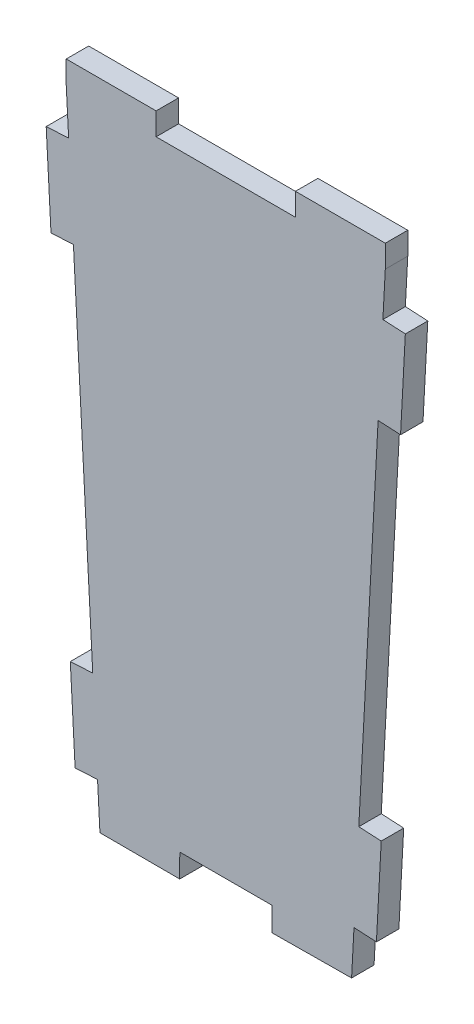
ISO-10303-21;
HEADER;
FILE_DESCRIPTION(('STEP AP214'),'2;1');
FILE_NAME('part.step','',(''),(''),'','','');
FILE_SCHEMA(('AUTOMOTIVE_DESIGN { 1 0 10303 214 1 1 1 1 }'));
ENDSEC;
DATA;
#1=APPLICATION_CONTEXT('core data for automotive mechanical design processes');
#2=APPLICATION_PROTOCOL_DEFINITION('international standard','automotive_design',2000,#1);
#3=PRODUCT_CONTEXT('',#1,'mechanical');
#4=PRODUCT('Part','Part','',(#3));
#5=PRODUCT_RELATED_PRODUCT_CATEGORY('part','',(#4));
#6=PRODUCT_DEFINITION_FORMATION('','',#4);
#7=PRODUCT_DEFINITION_CONTEXT('part definition',#1,'design');
#8=PRODUCT_DEFINITION('design','',#6,#7);
#9=PRODUCT_DEFINITION_SHAPE('','',#8);
#10=(LENGTH_UNIT() NAMED_UNIT(*) SI_UNIT(.MILLI.,.METRE.));
#11=(NAMED_UNIT(*) PLANE_ANGLE_UNIT() SI_UNIT($,.RADIAN.));
#12=(NAMED_UNIT(*) SI_UNIT($,.STERADIAN.) SOLID_ANGLE_UNIT());
#13=UNCERTAINTY_MEASURE_WITH_UNIT(LENGTH_MEASURE(1.E-05),#10,'distance_accuracy_value','');
#14=(GEOMETRIC_REPRESENTATION_CONTEXT(3) GLOBAL_UNCERTAINTY_ASSIGNED_CONTEXT((#13)) GLOBAL_UNIT_ASSIGNED_CONTEXT((#10,
#11,#12)) REPRESENTATION_CONTEXT('',''));
#15=CARTESIAN_POINT('',(0.,0.,0.));
#16=DIRECTION('',(0.,0.,1.));
#17=DIRECTION('',(1.,0.,0.));
#18=AXIS2_PLACEMENT_3D('',#15,#16,#17);
#19=CARTESIAN_POINT('',(681.706291729011,-153.636731680651,2.5));
#20=DIRECTION('',(-0.00832529663107923,0.999965344117487,0.));
#21=DIRECTION('',(-0.999965344117487,-0.00832529663107923,0.));
#22=AXIS2_PLACEMENT_3D('',#19,#20,#21);
#23=PLANE('',#22);
#24=DIRECTION('',(0.999965344117487,0.00832529663107923,0.));
#25=VECTOR('',#24,1.);
#26=CARTESIAN_POINT('',(681.706291729011,-153.636731680651,-2.5));
#27=LINE('',#26,#25);
#28=CARTESIAN_POINT('',(663.968757651605,-153.784407031169,-2.5));
#29=VERTEX_POINT('',#28);
#30=CARTESIAN_POINT('',(681.706291729011,-153.636731680651,-2.5));
#31=VERTEX_POINT('',#30);
#32=EDGE_CURVE('E261',#29,#31,#27,.T.);
#33=ORIENTED_EDGE('',*,*,#32,.T.);
#34=DIRECTION('',(0.,0.,-1.));
#35=VECTOR('',#34,1.);
#36=CARTESIAN_POINT('',(681.706291729011,-153.636731680651,2.5));
#37=LINE('',#36,#35);
#38=CARTESIAN_POINT('',(681.706291729011,-153.636731680651,2.5));
#39=VERTEX_POINT('',#38);
#40=EDGE_CURVE('E11',#39,#31,#37,.T.);
#41=ORIENTED_EDGE('',*,*,#40,.F.);
#42=DIRECTION('',(0.999965344117487,0.00832529663107923,0.));
#43=VECTOR('',#42,1.);
#44=CARTESIAN_POINT('',(681.706291729011,-153.636731680651,2.5));
#45=LINE('',#44,#43);
#46=CARTESIAN_POINT('',(663.968757651605,-153.784407031169,2.5));
#47=VERTEX_POINT('',#46);
#48=EDGE_CURVE('E319',#47,#39,#45,.T.);
#49=ORIENTED_EDGE('',*,*,#48,.F.);
#50=DIRECTION('',(0.,0.,-1.));
#51=VECTOR('',#50,1.);
#52=CARTESIAN_POINT('',(663.968757651605,-153.784407031169,2.5));
#53=LINE('',#52,#51);
#54=EDGE_CURVE('E257',#47,#29,#53,.T.);
#55=ORIENTED_EDGE('',*,*,#54,.T.);
#56=EDGE_LOOP('',(#33,#41,#49,#55));
#57=FACE_BOUND('',#56,.T.);
#58=ADVANCED_FACE('F33',(#57),#23,.F.);
#59=CARTESIAN_POINT('',(681.706291729011,-153.636731680651,2.5));
#60=DIRECTION('',(-0.998575452187384,0.0533579074623593,0.));
#61=DIRECTION('',(-0.0533579074623593,-0.998575452187384,0.));
#62=AXIS2_PLACEMENT_3D('',#59,#60,#61);
#63=PLANE('',#62);
#64=DIRECTION('',(0.0533579074623593,0.998575452187384,0.));
#65=VECTOR('',#64,1.);
#66=CARTESIAN_POINT('',(681.706291729011,-153.636731680651,-2.5));
#67=LINE('',#66,#65);
#68=CARTESIAN_POINT('',(682.239870803635,-143.650977158777,-2.5));
#69=VERTEX_POINT('',#68);
#70=EDGE_CURVE('E264',#31,#69,#67,.T.);
#71=ORIENTED_EDGE('',*,*,#70,.T.);
#72=DIRECTION('',(0.,0.,-1.));
#73=VECTOR('',#72,1.);
#74=CARTESIAN_POINT('',(682.239870803635,-143.650977158777,2.5));
#75=LINE('',#74,#73);
#76=CARTESIAN_POINT('',(682.239870803635,-143.650977158777,2.5));
#77=VERTEX_POINT('',#76);
#78=EDGE_CURVE('E41',#77,#69,#75,.T.);
#79=ORIENTED_EDGE('',*,*,#78,.F.);
#80=DIRECTION('',(0.0533579074623593,0.998575452187384,0.));
#81=VECTOR('',#80,1.);
#82=CARTESIAN_POINT('',(681.706291729011,-153.636731680651,2.5));
#83=LINE('',#82,#81);
#84=EDGE_CURVE('E158',#39,#77,#83,.T.);
#85=ORIENTED_EDGE('',*,*,#84,.F.);
#86=ORIENTED_EDGE('',*,*,#40,.T.);
#87=EDGE_LOOP('',(#71,#79,#85,#86));
#88=FACE_BOUND('',#87,.T.);
#89=ADVANCED_FACE('F487',(#88),#63,.F.);
#90=CARTESIAN_POINT('',(682.239870803635,-143.650977158777,2.5));
#91=DIRECTION('',(0.0533579074623155,0.998575452187386,0.));
#92=DIRECTION('',(-0.998575452187386,0.0533579074623155,0.));
#93=AXIS2_PLACEMENT_3D('',#90,#91,#92);
#94=PLANE('',#93);
#95=DIRECTION('',(0.998575452187386,-0.0533579074623155,0.));
#96=VECTOR('',#95,1.);
#97=CARTESIAN_POINT('',(682.239870803635,-143.650977158777,-2.5));
#98=LINE('',#97,#96);
#99=CARTESIAN_POINT('',(687.232748064571,-143.917766696089,-2.5));
#100=VERTEX_POINT('',#99);
#101=EDGE_CURVE('E266',#69,#100,#98,.T.);
#102=ORIENTED_EDGE('',*,*,#101,.T.);
#103=DIRECTION('',(0.,0.,-1.));
#104=VECTOR('',#103,1.);
#105=CARTESIAN_POINT('',(687.232748064571,-143.917766696089,2.5));
#106=LINE('',#105,#104);
#107=CARTESIAN_POINT('',(687.232748064571,-143.917766696089,2.5));
#108=VERTEX_POINT('',#107);
#109=EDGE_CURVE('E392',#108,#100,#106,.T.);
#110=ORIENTED_EDGE('',*,*,#109,.F.);
#111=DIRECTION('',(0.998575452187386,-0.0533579074623155,0.));
#112=VECTOR('',#111,1.);
#113=CARTESIAN_POINT('',(682.239870803635,-143.650977158777,2.5));
#114=LINE('',#113,#112);
#115=EDGE_CURVE('E400',#77,#108,#114,.T.);
#116=ORIENTED_EDGE('',*,*,#115,.F.);
#117=ORIENTED_EDGE('',*,*,#78,.T.);
#118=EDGE_LOOP('',(#102,#110,#116,#117));
#119=FACE_BOUND('',#118,.T.);
#120=ADVANCED_FACE('F398',(#119),#94,.F.);
#121=CARTESIAN_POINT('',(687.232748064571,-143.917766696089,2.5));
#122=DIRECTION('',(-0.998575452187384,0.0533579074623539,0.));
#123=DIRECTION('',(-0.0533579074623539,-0.998575452187384,0.));
#124=AXIS2_PLACEMENT_3D('',#121,#122,#123);
#125=PLANE('',#124);
#126=DIRECTION('',(0.0533579074623539,0.998575452187384,0.));
#127=VECTOR('',#126,1.);
#128=CARTESIAN_POINT('',(687.232748064571,-143.917766696089,-2.5));
#129=LINE('',#128,#127);
#130=CARTESIAN_POINT('',(688.299906213818,-123.946257652341,-2.5));
#131=VERTEX_POINT('',#130);
#132=EDGE_CURVE('E268',#100,#131,#129,.T.);
#133=ORIENTED_EDGE('',*,*,#132,.T.);
#134=DIRECTION('',(0.,0.,-1.));
#135=VECTOR('',#134,1.);
#136=CARTESIAN_POINT('',(688.299906213818,-123.946257652341,2.5));
#137=LINE('',#136,#135);
#138=CARTESIAN_POINT('',(688.299906213818,-123.946257652341,2.5));
#139=VERTEX_POINT('',#138);
#140=EDGE_CURVE('E389',#139,#131,#137,.T.);
#141=ORIENTED_EDGE('',*,*,#140,.F.);
#142=DIRECTION('',(0.0533579074623539,0.998575452187384,0.));
#143=VECTOR('',#142,1.);
#144=CARTESIAN_POINT('',(687.232748064571,-143.917766696089,2.5));
#145=LINE('',#144,#143);
#146=EDGE_CURVE('E418',#108,#139,#145,.T.);
#147=ORIENTED_EDGE('',*,*,#146,.F.);
#148=ORIENTED_EDGE('',*,*,#109,.T.);
#149=EDGE_LOOP('',(#133,#141,#147,#148));
#150=FACE_BOUND('',#149,.T.);
#151=ADVANCED_FACE('F409',(#150),#125,.F.);
#152=CARTESIAN_POINT('',(688.299906213818,-123.946257652341,2.5));
#153=DIRECTION('',(-0.0533579074622966,-0.998575452187387,0.));
#154=DIRECTION('',(0.998575452187387,-0.0533579074622966,0.));
#155=AXIS2_PLACEMENT_3D('',#152,#153,#154);
#156=PLANE('',#155);
#157=DIRECTION('',(-0.998575452187387,0.0533579074622966,0.));
#158=VECTOR('',#157,1.);
#159=CARTESIAN_POINT('',(688.299906213818,-123.946257652341,-2.5));
#160=LINE('',#159,#158);
#161=CARTESIAN_POINT('',(683.307028952881,-123.679468115029,-2.5));
#162=VERTEX_POINT('',#161);
#163=EDGE_CURVE('E270',#131,#162,#160,.T.);
#164=ORIENTED_EDGE('',*,*,#163,.T.);
#165=DIRECTION('',(0.,0.,-1.));
#166=VECTOR('',#165,1.);
#167=CARTESIAN_POINT('',(683.307028952881,-123.679468115029,2.5));
#168=LINE('',#167,#166);
#169=CARTESIAN_POINT('',(683.307028952881,-123.679468115029,2.5));
#170=VERTEX_POINT('',#169);
#171=EDGE_CURVE('E386',#170,#162,#168,.T.);
#172=ORIENTED_EDGE('',*,*,#171,.F.);
#173=DIRECTION('',(-0.998575452187387,0.0533579074622966,0.));
#174=VECTOR('',#173,1.);
#175=CARTESIAN_POINT('',(688.299906213818,-123.946257652341,2.5));
#176=LINE('',#175,#174);
#177=EDGE_CURVE('E415',#139,#170,#176,.T.);
#178=ORIENTED_EDGE('',*,*,#177,.F.);
#179=ORIENTED_EDGE('',*,*,#140,.T.);
#180=EDGE_LOOP('',(#164,#172,#178,#179));
#181=FACE_BOUND('',#180,.T.);
#182=ADVANCED_FACE('F413',(#181),#156,.F.);
#183=CARTESIAN_POINT('',(683.307028952881,-123.679468115029,2.5));
#184=DIRECTION('',(-0.998575452187387,0.0533579074623102,0.));
#185=DIRECTION('',(-0.0533579074623102,-0.998575452187387,0.));
#186=AXIS2_PLACEMENT_3D('',#183,#184,#185);
#187=PLANE('',#186);
#188=DIRECTION('',(0.0533579074623102,0.998575452187387,0.));
#189=VECTOR('',#188,1.);
#190=CARTESIAN_POINT('',(683.307028952881,-123.679468115029,-2.5));
#191=LINE('',#190,#189);
#192=CARTESIAN_POINT('',(687.605554505147,-43.2339952462708,-2.5));
#193=VERTEX_POINT('',#192);
#194=EDGE_CURVE('E272',#162,#193,#191,.T.);
#195=ORIENTED_EDGE('',*,*,#194,.T.);
#196=DIRECTION('',(0.,0.,-1.));
#197=VECTOR('',#196,1.);
#198=CARTESIAN_POINT('',(687.605554505147,-43.2339952462708,2.5));
#199=LINE('',#198,#197);
#200=CARTESIAN_POINT('',(687.605554505147,-43.2339952462708,2.5));
#201=VERTEX_POINT('',#200);
#202=EDGE_CURVE('E383',#201,#193,#199,.T.);
#203=ORIENTED_EDGE('',*,*,#202,.F.);
#204=DIRECTION('',(0.0533579074623102,0.998575452187387,0.));
#205=VECTOR('',#204,1.);
#206=CARTESIAN_POINT('',(683.307028952881,-123.679468115029,2.5));
#207=LINE('',#206,#205);
#208=EDGE_CURVE('E417',#170,#201,#207,.T.);
#209=ORIENTED_EDGE('',*,*,#208,.F.);
#210=ORIENTED_EDGE('',*,*,#171,.T.);
#211=EDGE_LOOP('',(#195,#203,#209,#210));
#212=FACE_BOUND('',#211,.T.);
#213=ADVANCED_FACE('F500',(#212),#187,.F.);
#214=CARTESIAN_POINT('',(692.598431766083,-43.5007847835838,2.5));
#215=DIRECTION('',(0.0533579074625992,0.998575452187371,0.));
#216=DIRECTION('',(-0.998575452187371,0.0533579074625992,0.));
#217=AXIS2_PLACEMENT_3D('',#214,#215,#216);
#218=PLANE('',#217);
#219=DIRECTION('',(0.998575452187371,-0.0533579074625992,0.));
#220=VECTOR('',#219,1.);
#221=CARTESIAN_POINT('',(692.598431766083,-43.5007847835838,-2.5));
#222=LINE('',#221,#220);
#223=CARTESIAN_POINT('',(692.598431766083,-43.5007847835838,-2.5));
#224=VERTEX_POINT('',#223);
#225=EDGE_CURVE('E274',#193,#224,#222,.T.);
#226=ORIENTED_EDGE('',*,*,#225,.T.);
#227=DIRECTION('',(0.,0.,-1.));
#228=VECTOR('',#227,1.);
#229=CARTESIAN_POINT('',(692.598431766083,-43.5007847835838,2.5));
#230=LINE('',#229,#228);
#231=CARTESIAN_POINT('',(692.598431766083,-43.5007847835838,2.5));
#232=VERTEX_POINT('',#231);
#233=EDGE_CURVE('E380',#232,#224,#230,.T.);
#234=ORIENTED_EDGE('',*,*,#233,.F.);
#235=DIRECTION('',(0.998575452187371,-0.0533579074625992,0.));
#236=VECTOR('',#235,1.);
#237=CARTESIAN_POINT('',(692.598431766083,-43.5007847835838,2.5));
#238=LINE('',#237,#236);
#239=EDGE_CURVE('E420',#201,#232,#238,.T.);
#240=ORIENTED_EDGE('',*,*,#239,.F.);
#241=ORIENTED_EDGE('',*,*,#202,.T.);
#242=EDGE_LOOP('',(#226,#234,#240,#241));
#243=FACE_BOUND('',#242,.T.);
#244=ADVANCED_FACE('F503',(#243),#218,.F.);
#245=CARTESIAN_POINT('',(693.665589915331,-23.5292757398362,2.5));
#246=DIRECTION('',(-0.998575452187383,0.0533579074623871,0.));
#247=DIRECTION('',(-0.0533579074623871,-0.998575452187383,0.));
#248=AXIS2_PLACEMENT_3D('',#245,#246,#247);
#249=PLANE('',#248);
#250=DIRECTION('',(0.0533579074623871,0.998575452187383,0.));
#251=VECTOR('',#250,1.);
#252=CARTESIAN_POINT('',(693.665589915331,-23.5292757398362,-2.5));
#253=LINE('',#252,#251);
#254=CARTESIAN_POINT('',(693.665589915331,-23.5292757398362,-2.5));
#255=VERTEX_POINT('',#254);
#256=EDGE_CURVE('E276',#224,#255,#253,.T.);
#257=ORIENTED_EDGE('',*,*,#256,.T.);
#258=DIRECTION('',(0.,0.,-1.));
#259=VECTOR('',#258,1.);
#260=CARTESIAN_POINT('',(693.665589915331,-23.5292757398362,2.5));
#261=LINE('',#260,#259);
#262=CARTESIAN_POINT('',(693.665589915331,-23.5292757398362,2.5));
#263=VERTEX_POINT('',#262);
#264=EDGE_CURVE('E377',#263,#255,#261,.T.);
#265=ORIENTED_EDGE('',*,*,#264,.F.);
#266=DIRECTION('',(0.0533579074623871,0.998575452187383,0.));
#267=VECTOR('',#266,1.);
#268=CARTESIAN_POINT('',(693.665589915331,-23.5292757398362,2.5));
#269=LINE('',#268,#267);
#270=EDGE_CURVE('E426',#232,#263,#269,.T.);
#271=ORIENTED_EDGE('',*,*,#270,.F.);
#272=ORIENTED_EDGE('',*,*,#233,.T.);
#273=EDGE_LOOP('',(#257,#265,#271,#272));
#274=FACE_BOUND('',#273,.T.);
#275=ADVANCED_FACE('F507',(#274),#249,.F.);
#276=CARTESIAN_POINT('',(688.672712654393,-23.2624862025233,2.5));
#277=DIRECTION('',(-0.0533579074625884,-0.998575452187372,0.));
#278=DIRECTION('',(0.998575452187372,-0.0533579074625884,0.));
#279=AXIS2_PLACEMENT_3D('',#276,#277,#278);
#280=PLANE('',#279);
#281=DIRECTION('',(-0.998575452187372,0.0533579074625884,0.));
#282=VECTOR('',#281,1.);
#283=CARTESIAN_POINT('',(688.672712654393,-23.2624862025233,-2.5));
#284=LINE('',#283,#282);
#285=CARTESIAN_POINT('',(688.672712654393,-23.2624862025233,-2.5));
#286=VERTEX_POINT('',#285);
#287=EDGE_CURVE('E278',#255,#286,#284,.T.);
#288=ORIENTED_EDGE('',*,*,#287,.T.);
#289=DIRECTION('',(0.,0.,-1.));
#290=VECTOR('',#289,1.);
#291=CARTESIAN_POINT('',(688.672712654393,-23.2624862025233,2.5));
#292=LINE('',#291,#290);
#293=CARTESIAN_POINT('',(688.672712654393,-23.2624862025233,2.5));
#294=VERTEX_POINT('',#293);
#295=EDGE_CURVE('E374',#294,#286,#292,.T.);
#296=ORIENTED_EDGE('',*,*,#295,.F.);
#297=DIRECTION('',(-0.998575452187372,0.0533579074625884,0.));
#298=VECTOR('',#297,1.);
#299=CARTESIAN_POINT('',(688.672712654393,-23.2624862025233,2.5));
#300=LINE('',#299,#298);
#301=EDGE_CURVE('E428',#263,#294,#300,.T.);
#302=ORIENTED_EDGE('',*,*,#301,.F.);
#303=ORIENTED_EDGE('',*,*,#264,.T.);
#304=EDGE_LOOP('',(#288,#296,#302,#303));
#305=FACE_BOUND('',#304,.T.);
#306=ADVANCED_FACE('F511',(#305),#280,.F.);
#307=CARTESIAN_POINT('',(689.206291729017,-13.2767316806509,2.5));
#308=DIRECTION('',(-0.998575452187385,0.053357907462345,0.));
#309=DIRECTION('',(-0.053357907462345,-0.998575452187385,0.));
#310=AXIS2_PLACEMENT_3D('',#307,#308,#309);
#311=PLANE('',#310);
#312=DIRECTION('',(0.053357907462345,0.998575452187385,0.));
#313=VECTOR('',#312,1.);
#314=CARTESIAN_POINT('',(689.206291729017,-13.2767316806509,-2.5));
#315=LINE('',#314,#313);
#316=CARTESIAN_POINT('',(689.206291729017,-13.2767316806509,-2.5));
#317=VERTEX_POINT('',#316);
#318=EDGE_CURVE('E280',#286,#317,#315,.T.);
#319=ORIENTED_EDGE('',*,*,#318,.T.);
#320=DIRECTION('',(0.,0.,-1.));
#321=VECTOR('',#320,1.);
#322=CARTESIAN_POINT('',(689.206291729017,-13.2767316806509,2.5));
#323=LINE('',#322,#321);
#324=CARTESIAN_POINT('',(689.206291729017,-13.2767316806509,2.5));
#325=VERTEX_POINT('',#324);
#326=EDGE_CURVE('E371',#325,#317,#323,.T.);
#327=ORIENTED_EDGE('',*,*,#326,.F.);
#328=DIRECTION('',(0.053357907462345,0.998575452187385,0.));
#329=VECTOR('',#328,1.);
#330=CARTESIAN_POINT('',(689.206291729017,-13.2767316806509,2.5));
#331=LINE('',#330,#329);
#332=EDGE_CURVE('E430',#294,#325,#331,.T.);
#333=ORIENTED_EDGE('',*,*,#332,.F.);
#334=ORIENTED_EDGE('',*,*,#295,.T.);
#335=EDGE_LOOP('',(#319,#327,#333,#334));
#336=FACE_BOUND('',#335,.T.);
#337=ADVANCED_FACE('F515',(#336),#311,.F.);
#338=CARTESIAN_POINT('',(689.206291729017,-13.2767316806509,2.5));
#339=DIRECTION('',(-1.,0.,0.));
#340=DIRECTION('',(0.,-1.,0.));
#341=AXIS2_PLACEMENT_3D('',#338,#339,#340);
#342=PLANE('',#341);
#343=DIRECTION('',(0.,1.,0.));
#344=VECTOR('',#343,1.);
#345=CARTESIAN_POINT('',(689.206291729017,-13.2767316806509,-2.5));
#346=LINE('',#345,#344);
#347=CARTESIAN_POINT('',(689.206291729017,-8.27673168065064,-2.5));
#348=VERTEX_POINT('',#347);
#349=EDGE_CURVE('E282',#317,#348,#346,.T.);
#350=ORIENTED_EDGE('',*,*,#349,.T.);
#351=DIRECTION('',(0.,0.,-1.));
#352=VECTOR('',#351,1.);
#353=CARTESIAN_POINT('',(689.206291729017,-8.27673168065064,2.5));
#354=LINE('',#353,#352);
#355=CARTESIAN_POINT('',(689.206291729017,-8.27673168065064,2.5));
#356=VERTEX_POINT('',#355);
#357=EDGE_CURVE('E368',#356,#348,#354,.T.);
#358=ORIENTED_EDGE('',*,*,#357,.F.);
#359=DIRECTION('',(0.,1.,0.));
#360=VECTOR('',#359,1.);
#361=CARTESIAN_POINT('',(689.206291729017,-13.2767316806509,2.5));
#362=LINE('',#361,#360);
#363=EDGE_CURVE('E432',#325,#356,#362,.T.);
#364=ORIENTED_EDGE('',*,*,#363,.F.);
#365=ORIENTED_EDGE('',*,*,#326,.T.);
#366=EDGE_LOOP('',(#350,#358,#364,#365));
#367=FACE_BOUND('',#366,.T.);
#368=ADVANCED_FACE('F519',(#367),#342,.F.);
#369=CARTESIAN_POINT('',(689.206291729017,-8.27673168065064,2.5));
#370=DIRECTION('',(0.,-1.,0.));
#371=DIRECTION('',(1.,0.,0.));
#372=AXIS2_PLACEMENT_3D('',#369,#370,#371);
#373=PLANE('',#372);
#374=DIRECTION('',(-1.,0.,0.));
#375=VECTOR('',#374,1.);
#376=CARTESIAN_POINT('',(689.206291729017,-8.27673168065064,-2.5));
#377=LINE('',#376,#375);
#378=CARTESIAN_POINT('',(669.206291729017,-8.27673168064979,-2.5));
#379=VERTEX_POINT('',#378);
#380=EDGE_CURVE('E284',#348,#379,#377,.T.);
#381=ORIENTED_EDGE('',*,*,#380,.T.);
#382=DIRECTION('',(0.,0.,-1.));
#383=VECTOR('',#382,1.);
#384=CARTESIAN_POINT('',(669.206291729017,-8.27673168064979,2.5));
#385=LINE('',#384,#383);
#386=CARTESIAN_POINT('',(669.206291729017,-8.27673168064979,2.5));
#387=VERTEX_POINT('',#386);
#388=EDGE_CURVE('E365',#387,#379,#385,.T.);
#389=ORIENTED_EDGE('',*,*,#388,.F.);
#390=DIRECTION('',(-1.,0.,0.));
#391=VECTOR('',#390,1.);
#392=CARTESIAN_POINT('',(689.206291729017,-8.27673168065064,2.5));
#393=LINE('',#392,#391);
#394=EDGE_CURVE('E434',#356,#387,#393,.T.);
#395=ORIENTED_EDGE('',*,*,#394,.F.);
#396=ORIENTED_EDGE('',*,*,#357,.T.);
#397=EDGE_LOOP('',(#381,#389,#395,#396));
#398=FACE_BOUND('',#397,.T.);
#399=ADVANCED_FACE('F523',(#398),#373,.F.);
#400=CARTESIAN_POINT('',(669.206291729017,-8.27673168064979,2.5));
#401=DIRECTION('',(1.,0.,0.));
#402=DIRECTION('',(0.,1.,0.));
#403=AXIS2_PLACEMENT_3D('',#400,#401,#402);
#404=PLANE('',#403);
#405=DIRECTION('',(0.,-1.,0.));
#406=VECTOR('',#405,1.);
#407=CARTESIAN_POINT('',(669.206291729017,-8.27673168064979,-2.5));
#408=LINE('',#407,#406);
#409=CARTESIAN_POINT('',(669.206291729017,-13.2767316806501,-2.5));
#410=VERTEX_POINT('',#409);
#411=EDGE_CURVE('E286',#379,#410,#408,.T.);
#412=ORIENTED_EDGE('',*,*,#411,.T.);
#413=DIRECTION('',(0.,0.,-1.));
#414=VECTOR('',#413,1.);
#415=CARTESIAN_POINT('',(669.206291729017,-13.2767316806501,2.5));
#416=LINE('',#415,#414);
#417=CARTESIAN_POINT('',(669.206291729017,-13.2767316806501,2.5));
#418=VERTEX_POINT('',#417);
#419=EDGE_CURVE('E362',#418,#410,#416,.T.);
#420=ORIENTED_EDGE('',*,*,#419,.F.);
#421=DIRECTION('',(0.,-1.,0.));
#422=VECTOR('',#421,1.);
#423=CARTESIAN_POINT('',(669.206291729017,-8.27673168064979,2.5));
#424=LINE('',#423,#422);
#425=EDGE_CURVE('E436',#387,#418,#424,.T.);
#426=ORIENTED_EDGE('',*,*,#425,.F.);
#427=ORIENTED_EDGE('',*,*,#388,.T.);
#428=EDGE_LOOP('',(#412,#420,#426,#427));
#429=FACE_BOUND('',#428,.T.);
#430=ADVANCED_FACE('F527',(#429),#404,.F.);
#431=CARTESIAN_POINT('',(669.206291729017,-13.2767316806501,2.5));
#432=DIRECTION('',(0.,-1.,0.));
#433=DIRECTION('',(1.,0.,0.));
#434=AXIS2_PLACEMENT_3D('',#431,#432,#433);
#435=PLANE('',#434);
#436=DIRECTION('',(-1.,0.,0.));
#437=VECTOR('',#436,1.);
#438=CARTESIAN_POINT('',(669.206291729017,-13.2767316806501,-2.5));
#439=LINE('',#438,#437);
#440=CARTESIAN_POINT('',(638.206322644312,-13.2767316806488,-2.5));
#441=VERTEX_POINT('',#440);
#442=EDGE_CURVE('E288',#410,#441,#439,.T.);
#443=ORIENTED_EDGE('',*,*,#442,.T.);
#444=DIRECTION('',(0.,0.,-1.));
#445=VECTOR('',#444,1.);
#446=CARTESIAN_POINT('',(638.206322644312,-13.2767316806488,2.5));
#447=LINE('',#446,#445);
#448=CARTESIAN_POINT('',(638.206322644312,-13.2767316806488,2.5));
#449=VERTEX_POINT('',#448);
#450=EDGE_CURVE('E359',#449,#441,#447,.T.);
#451=ORIENTED_EDGE('',*,*,#450,.F.);
#452=DIRECTION('',(-1.,0.,0.));
#453=VECTOR('',#452,1.);
#454=CARTESIAN_POINT('',(669.206291729017,-13.2767316806501,2.5));
#455=LINE('',#454,#453);
#456=EDGE_CURVE('E438',#418,#449,#455,.T.);
#457=ORIENTED_EDGE('',*,*,#456,.F.);
#458=ORIENTED_EDGE('',*,*,#419,.T.);
#459=EDGE_LOOP('',(#443,#451,#457,#458));
#460=FACE_BOUND('',#459,.T.);
#461=ADVANCED_FACE('F531',(#460),#435,.F.);
#462=CARTESIAN_POINT('',(638.206322644312,-8.27673168064847,2.5));
#463=DIRECTION('',(-1.,0.,0.));
#464=DIRECTION('',(0.,-1.,0.));
#465=AXIS2_PLACEMENT_3D('',#462,#463,#464);
#466=PLANE('',#465);
#467=DIRECTION('',(0.,1.,0.));
#468=VECTOR('',#467,1.);
#469=CARTESIAN_POINT('',(638.206322644312,-8.27673168064847,-2.5));
#470=LINE('',#469,#468);
#471=CARTESIAN_POINT('',(638.206322644312,-8.27673168064847,-2.5));
#472=VERTEX_POINT('',#471);
#473=EDGE_CURVE('E290',#441,#472,#470,.T.);
#474=ORIENTED_EDGE('',*,*,#473,.T.);
#475=DIRECTION('',(0.,0.,-1.));
#476=VECTOR('',#475,1.);
#477=CARTESIAN_POINT('',(638.206322644312,-8.27673168064847,2.5));
#478=LINE('',#477,#476);
#479=CARTESIAN_POINT('',(638.206322644312,-8.27673168064847,2.5));
#480=VERTEX_POINT('',#479);
#481=EDGE_CURVE('E356',#480,#472,#478,.T.);
#482=ORIENTED_EDGE('',*,*,#481,.F.);
#483=DIRECTION('',(0.,1.,0.));
#484=VECTOR('',#483,1.);
#485=CARTESIAN_POINT('',(638.206322644312,-8.27673168064847,2.5));
#486=LINE('',#485,#484);
#487=EDGE_CURVE('E440',#449,#480,#486,.T.);
#488=ORIENTED_EDGE('',*,*,#487,.F.);
#489=ORIENTED_EDGE('',*,*,#450,.T.);
#490=EDGE_LOOP('',(#474,#482,#488,#489));
#491=FACE_BOUND('',#490,.T.);
#492=ADVANCED_FACE('F535',(#491),#466,.F.);
#493=CARTESIAN_POINT('',(618.206322644312,-8.27673168064762,2.5));
#494=DIRECTION('',(0.,-1.,0.));
#495=DIRECTION('',(1.,0.,0.));
#496=AXIS2_PLACEMENT_3D('',#493,#494,#495);
#497=PLANE('',#496);
#498=DIRECTION('',(-1.,0.,0.));
#499=VECTOR('',#498,1.);
#500=CARTESIAN_POINT('',(618.206322644312,-8.27673168064762,-2.5));
#501=LINE('',#500,#499);
#502=CARTESIAN_POINT('',(618.206322644312,-8.27673168064762,-2.5));
#503=VERTEX_POINT('',#502);
#504=EDGE_CURVE('E292',#472,#503,#501,.T.);
#505=ORIENTED_EDGE('',*,*,#504,.T.);
#506=DIRECTION('',(0.,0.,-1.));
#507=VECTOR('',#506,1.);
#508=CARTESIAN_POINT('',(618.206322644312,-8.27673168064762,2.5));
#509=LINE('',#508,#507);
#510=CARTESIAN_POINT('',(618.206322644312,-8.27673168064762,2.5));
#511=VERTEX_POINT('',#510);
#512=EDGE_CURVE('E353',#511,#503,#509,.T.);
#513=ORIENTED_EDGE('',*,*,#512,.F.);
#514=DIRECTION('',(-1.,0.,0.));
#515=VECTOR('',#514,1.);
#516=CARTESIAN_POINT('',(618.206322644312,-8.27673168064762,2.5));
#517=LINE('',#516,#515);
#518=EDGE_CURVE('E442',#480,#511,#517,.T.);
#519=ORIENTED_EDGE('',*,*,#518,.F.);
#520=ORIENTED_EDGE('',*,*,#481,.T.);
#521=EDGE_LOOP('',(#505,#513,#519,#520));
#522=FACE_BOUND('',#521,.T.);
#523=ADVANCED_FACE('F539',(#522),#497,.F.);
#524=CARTESIAN_POINT('',(618.206322644312,-13.2767316806479,2.5));
#525=DIRECTION('',(1.,0.,0.));
#526=DIRECTION('',(0.,1.,0.));
#527=AXIS2_PLACEMENT_3D('',#524,#525,#526);
#528=PLANE('',#527);
#529=DIRECTION('',(0.,-1.,0.));
#530=VECTOR('',#529,1.);
#531=CARTESIAN_POINT('',(618.206322644312,-13.2767316806479,-2.5));
#532=LINE('',#531,#530);
#533=CARTESIAN_POINT('',(618.206322644312,-13.2767316806479,-2.5));
#534=VERTEX_POINT('',#533);
#535=EDGE_CURVE('E294',#503,#534,#532,.T.);
#536=ORIENTED_EDGE('',*,*,#535,.T.);
#537=DIRECTION('',(0.,0.,-1.));
#538=VECTOR('',#537,1.);
#539=CARTESIAN_POINT('',(618.206322644312,-13.2767316806479,2.5));
#540=LINE('',#539,#538);
#541=CARTESIAN_POINT('',(618.206322644312,-13.2767316806479,2.5));
#542=VERTEX_POINT('',#541);
#543=EDGE_CURVE('E350',#542,#534,#540,.T.);
#544=ORIENTED_EDGE('',*,*,#543,.F.);
#545=DIRECTION('',(0.,-1.,0.));
#546=VECTOR('',#545,1.);
#547=CARTESIAN_POINT('',(618.206322644312,-13.2767316806479,2.5));
#548=LINE('',#547,#546);
#549=EDGE_CURVE('E444',#511,#542,#548,.T.);
#550=ORIENTED_EDGE('',*,*,#549,.F.);
#551=ORIENTED_EDGE('',*,*,#512,.T.);
#552=EDGE_LOOP('',(#536,#544,#550,#551));
#553=FACE_BOUND('',#552,.T.);
#554=ADVANCED_FACE('F543',(#553),#528,.F.);
#555=CARTESIAN_POINT('',(618.206322644312,-13.2767316806479,2.5));
#556=DIRECTION('',(0.998575452187389,0.0533579074622673,0.));
#557=DIRECTION('',(-0.0533579074622673,0.998575452187389,0.));
#558=AXIS2_PLACEMENT_3D('',#555,#556,#557);
#559=PLANE('',#558);
#560=DIRECTION('',(0.0533579074622673,-0.998575452187389,0.));
#561=VECTOR('',#560,1.);
#562=CARTESIAN_POINT('',(618.206322644312,-13.2767316806479,-2.5));
#563=LINE('',#562,#561);
#564=CARTESIAN_POINT('',(618.739901718934,-23.2624862025203,-2.5));
#565=VERTEX_POINT('',#564);
#566=EDGE_CURVE('E296',#534,#565,#563,.T.);
#567=ORIENTED_EDGE('',*,*,#566,.T.);
#568=DIRECTION('',(0.,0.,-1.));
#569=VECTOR('',#568,1.);
#570=CARTESIAN_POINT('',(618.739901718934,-23.2624862025203,2.5));
#571=LINE('',#570,#569);
#572=CARTESIAN_POINT('',(618.739901718934,-23.2624862025203,2.5));
#573=VERTEX_POINT('',#572);
#574=EDGE_CURVE('E347',#573,#565,#571,.T.);
#575=ORIENTED_EDGE('',*,*,#574,.F.);
#576=DIRECTION('',(0.0533579074622673,-0.998575452187389,0.));
#577=VECTOR('',#576,1.);
#578=CARTESIAN_POINT('',(618.206322644312,-13.2767316806479,2.5));
#579=LINE('',#578,#577);
#580=EDGE_CURVE('E446',#542,#573,#579,.T.);
#581=ORIENTED_EDGE('',*,*,#580,.F.);
#582=ORIENTED_EDGE('',*,*,#543,.T.);
#583=EDGE_LOOP('',(#567,#575,#581,#582));
#584=FACE_BOUND('',#583,.T.);
#585=ADVANCED_FACE('F547',(#584),#559,.F.);
#586=CARTESIAN_POINT('',(618.739901718934,-23.2624862025203,2.5));
#587=DIRECTION('',(0.053357907462504,-0.998575452187376,0.));
#588=DIRECTION('',(0.998575452187376,0.053357907462504,0.));
#589=AXIS2_PLACEMENT_3D('',#586,#587,#588);
#590=PLANE('',#589);
#591=DIRECTION('',(-0.998575452187376,-0.053357907462504,0.));
#592=VECTOR('',#591,1.);
#593=CARTESIAN_POINT('',(618.739901718934,-23.2624862025203,-2.5));
#594=LINE('',#593,#592);
#595=CARTESIAN_POINT('',(613.747024457997,-23.5292757398328,-2.5));
#596=VERTEX_POINT('',#595);
#597=EDGE_CURVE('E298',#565,#596,#594,.T.);
#598=ORIENTED_EDGE('',*,*,#597,.T.);
#599=DIRECTION('',(0.,0.,-1.));
#600=VECTOR('',#599,1.);
#601=CARTESIAN_POINT('',(613.747024457997,-23.5292757398328,2.5));
#602=LINE('',#601,#600);
#603=CARTESIAN_POINT('',(613.747024457997,-23.5292757398328,2.5));
#604=VERTEX_POINT('',#603);
#605=EDGE_CURVE('E344',#604,#596,#602,.T.);
#606=ORIENTED_EDGE('',*,*,#605,.F.);
#607=DIRECTION('',(-0.998575452187376,-0.053357907462504,0.));
#608=VECTOR('',#607,1.);
#609=CARTESIAN_POINT('',(618.739901718934,-23.2624862025203,2.5));
#610=LINE('',#609,#608);
#611=EDGE_CURVE('E448',#573,#604,#610,.T.);
#612=ORIENTED_EDGE('',*,*,#611,.F.);
#613=ORIENTED_EDGE('',*,*,#574,.T.);
#614=EDGE_LOOP('',(#598,#606,#612,#613));
#615=FACE_BOUND('',#614,.T.);
#616=ADVANCED_FACE('F551',(#615),#590,.F.);
#617=CARTESIAN_POINT('',(613.747024457997,-23.5292757398328,2.5));
#618=DIRECTION('',(0.998575452187387,0.0533579074623039,0.));
#619=DIRECTION('',(-0.0533579074623039,0.998575452187387,0.));
#620=AXIS2_PLACEMENT_3D('',#617,#618,#619);
#621=PLANE('',#620);
#622=DIRECTION('',(0.0533579074623039,-0.998575452187387,0.));
#623=VECTOR('',#622,1.);
#624=CARTESIAN_POINT('',(613.747024457997,-23.5292757398328,-2.5));
#625=LINE('',#624,#623);
#626=CARTESIAN_POINT('',(614.814182607243,-43.5007847835805,-2.5));
#627=VERTEX_POINT('',#626);
#628=EDGE_CURVE('E300',#596,#627,#625,.T.);
#629=ORIENTED_EDGE('',*,*,#628,.T.);
#630=DIRECTION('',(0.,0.,-1.));
#631=VECTOR('',#630,1.);
#632=CARTESIAN_POINT('',(614.814182607243,-43.5007847835805,2.5));
#633=LINE('',#632,#631);
#634=CARTESIAN_POINT('',(614.814182607243,-43.5007847835805,2.5));
#635=VERTEX_POINT('',#634);
#636=EDGE_CURVE('E341',#635,#627,#633,.T.);
#637=ORIENTED_EDGE('',*,*,#636,.F.);
#638=DIRECTION('',(0.0533579074623039,-0.998575452187387,0.));
#639=VECTOR('',#638,1.);
#640=CARTESIAN_POINT('',(613.747024457997,-23.5292757398328,2.5));
#641=LINE('',#640,#639);
#642=EDGE_CURVE('E450',#604,#635,#641,.T.);
#643=ORIENTED_EDGE('',*,*,#642,.F.);
#644=ORIENTED_EDGE('',*,*,#605,.T.);
#645=EDGE_LOOP('',(#629,#637,#643,#644));
#646=FACE_BOUND('',#645,.T.);
#647=ADVANCED_FACE('F555',(#646),#621,.F.);
#648=CARTESIAN_POINT('',(614.814182607243,-43.5007847835805,2.5));
#649=DIRECTION('',(-0.0533579074625085,0.998575452187376,0.));
#650=DIRECTION('',(-0.998575452187376,-0.0533579074625085,0.));
#651=AXIS2_PLACEMENT_3D('',#648,#649,#650);
#652=PLANE('',#651);
#653=DIRECTION('',(0.998575452187376,0.0533579074625085,0.));
#654=VECTOR('',#653,1.);
#655=CARTESIAN_POINT('',(614.814182607243,-43.5007847835805,-2.5));
#656=LINE('',#655,#654);
#657=CARTESIAN_POINT('',(619.80705986818,-43.233995246268,-2.5));
#658=VERTEX_POINT('',#657);
#659=EDGE_CURVE('E302',#627,#658,#656,.T.);
#660=ORIENTED_EDGE('',*,*,#659,.T.);
#661=DIRECTION('',(0.,0.,-1.));
#662=VECTOR('',#661,1.);
#663=CARTESIAN_POINT('',(619.80705986818,-43.233995246268,2.5));
#664=LINE('',#663,#662);
#665=CARTESIAN_POINT('',(619.80705986818,-43.233995246268,2.5));
#666=VERTEX_POINT('',#665);
#667=EDGE_CURVE('E338',#666,#658,#664,.T.);
#668=ORIENTED_EDGE('',*,*,#667,.F.);
#669=DIRECTION('',(0.998575452187376,0.0533579074625085,0.));
#670=VECTOR('',#669,1.);
#671=CARTESIAN_POINT('',(614.814182607243,-43.5007847835805,2.5));
#672=LINE('',#671,#670);
#673=EDGE_CURVE('E452',#635,#666,#672,.T.);
#674=ORIENTED_EDGE('',*,*,#673,.F.);
#675=ORIENTED_EDGE('',*,*,#636,.T.);
#676=EDGE_LOOP('',(#660,#668,#674,#675));
#677=FACE_BOUND('',#676,.T.);
#678=ADVANCED_FACE('F559',(#677),#652,.F.);
#679=CARTESIAN_POINT('',(624.105585420439,-123.679468115027,2.5));
#680=DIRECTION('',(0.998575452187391,0.0533579074622248,0.));
#681=DIRECTION('',(-0.0533579074622248,0.998575452187391,0.));
#682=AXIS2_PLACEMENT_3D('',#679,#680,#681);
#683=PLANE('',#682);
#684=DIRECTION('',(0.0533579074622248,-0.998575452187391,0.));
#685=VECTOR('',#684,1.);
#686=CARTESIAN_POINT('',(624.105585420439,-123.679468115027,-2.5));
#687=LINE('',#686,#685);
#688=CARTESIAN_POINT('',(624.105585420439,-123.679468115027,-2.5));
#689=VERTEX_POINT('',#688);
#690=EDGE_CURVE('E304',#658,#689,#687,.T.);
#691=ORIENTED_EDGE('',*,*,#690,.T.);
#692=DIRECTION('',(0.,0.,-1.));
#693=VECTOR('',#692,1.);
#694=CARTESIAN_POINT('',(624.105585420439,-123.679468115027,2.5));
#695=LINE('',#694,#693);
#696=CARTESIAN_POINT('',(624.105585420439,-123.679468115027,2.5));
#697=VERTEX_POINT('',#696);
#698=EDGE_CURVE('E335',#697,#689,#695,.T.);
#699=ORIENTED_EDGE('',*,*,#698,.F.);
#700=DIRECTION('',(0.0533579074622248,-0.998575452187391,0.));
#701=VECTOR('',#700,1.);
#702=CARTESIAN_POINT('',(624.105585420439,-123.679468115027,2.5));
#703=LINE('',#702,#701);
#704=EDGE_CURVE('E454',#666,#697,#703,.T.);
#705=ORIENTED_EDGE('',*,*,#704,.F.);
#706=ORIENTED_EDGE('',*,*,#667,.T.);
#707=EDGE_LOOP('',(#691,#699,#705,#706));
#708=FACE_BOUND('',#707,.T.);
#709=ADVANCED_FACE('F563',(#708),#683,.F.);
#710=CARTESIAN_POINT('',(619.112708159501,-123.946257652338,2.5));
#711=DIRECTION('',(0.0533579074622179,-0.998575452187392,0.));
#712=DIRECTION('',(0.998575452187392,0.0533579074622179,0.));
#713=AXIS2_PLACEMENT_3D('',#710,#711,#712);
#714=PLANE('',#713);
#715=DIRECTION('',(-0.998575452187392,-0.0533579074622179,0.));
#716=VECTOR('',#715,1.);
#717=CARTESIAN_POINT('',(619.112708159501,-123.946257652338,-2.5));
#718=LINE('',#717,#716);
#719=CARTESIAN_POINT('',(619.112708159501,-123.946257652338,-2.5));
#720=VERTEX_POINT('',#719);
#721=EDGE_CURVE('E306',#689,#720,#718,.T.);
#722=ORIENTED_EDGE('',*,*,#721,.T.);
#723=DIRECTION('',(0.,0.,-1.));
#724=VECTOR('',#723,1.);
#725=CARTESIAN_POINT('',(619.112708159501,-123.946257652338,2.5));
#726=LINE('',#725,#724);
#727=CARTESIAN_POINT('',(619.112708159501,-123.946257652338,2.5));
#728=VERTEX_POINT('',#727);
#729=EDGE_CURVE('E332',#728,#720,#726,.T.);
#730=ORIENTED_EDGE('',*,*,#729,.F.);
#731=DIRECTION('',(-0.998575452187392,-0.0533579074622179,0.));
#732=VECTOR('',#731,1.);
#733=CARTESIAN_POINT('',(619.112708159501,-123.946257652338,2.5));
#734=LINE('',#733,#732);
#735=EDGE_CURVE('E456',#697,#728,#734,.T.);
#736=ORIENTED_EDGE('',*,*,#735,.F.);
#737=ORIENTED_EDGE('',*,*,#698,.T.);
#738=EDGE_LOOP('',(#722,#730,#736,#737));
#739=FACE_BOUND('',#738,.T.);
#740=ADVANCED_FACE('F567',(#739),#714,.F.);
#741=CARTESIAN_POINT('',(620.179866308747,-143.917766696086,2.5));
#742=DIRECTION('',(0.998575452187389,0.0533579074622651,0.));
#743=DIRECTION('',(-0.0533579074622651,0.998575452187389,0.));
#744=AXIS2_PLACEMENT_3D('',#741,#742,#743);
#745=PLANE('',#744);
#746=DIRECTION('',(0.0533579074622651,-0.998575452187389,0.));
#747=VECTOR('',#746,1.);
#748=CARTESIAN_POINT('',(620.179866308747,-143.917766696086,-2.5));
#749=LINE('',#748,#747);
#750=CARTESIAN_POINT('',(620.179866308747,-143.917766696086,-2.5));
#751=VERTEX_POINT('',#750);
#752=EDGE_CURVE('E308',#720,#751,#749,.T.);
#753=ORIENTED_EDGE('',*,*,#752,.T.);
#754=DIRECTION('',(0.,0.,-1.));
#755=VECTOR('',#754,1.);
#756=CARTESIAN_POINT('',(620.179866308747,-143.917766696086,2.5));
#757=LINE('',#756,#755);
#758=CARTESIAN_POINT('',(620.179866308747,-143.917766696086,2.5));
#759=VERTEX_POINT('',#758);
#760=EDGE_CURVE('E329',#759,#751,#757,.T.);
#761=ORIENTED_EDGE('',*,*,#760,.F.);
#762=DIRECTION('',(0.0533579074622651,-0.998575452187389,0.));
#763=VECTOR('',#762,1.);
#764=CARTESIAN_POINT('',(620.179866308747,-143.917766696086,2.5));
#765=LINE('',#764,#763);
#766=EDGE_CURVE('E458',#728,#759,#765,.T.);
#767=ORIENTED_EDGE('',*,*,#766,.F.);
#768=ORIENTED_EDGE('',*,*,#729,.T.);
#769=EDGE_LOOP('',(#753,#761,#767,#768));
#770=FACE_BOUND('',#769,.T.);
#771=ADVANCED_FACE('F571',(#770),#745,.F.);
#772=CARTESIAN_POINT('',(625.172743569683,-143.650977158775,2.5));
#773=DIRECTION('',(-0.053357907462227,0.998575452187391,0.));
#774=DIRECTION('',(-0.998575452187391,-0.053357907462227,0.));
#775=AXIS2_PLACEMENT_3D('',#772,#773,#774);
#776=PLANE('',#775);
#777=DIRECTION('',(0.998575452187391,0.053357907462227,0.));
#778=VECTOR('',#777,1.);
#779=CARTESIAN_POINT('',(625.172743569683,-143.650977158775,-2.5));
#780=LINE('',#779,#778);
#781=CARTESIAN_POINT('',(625.172743569683,-143.650977158775,-2.5));
#782=VERTEX_POINT('',#781);
#783=EDGE_CURVE('E310',#751,#782,#780,.T.);
#784=ORIENTED_EDGE('',*,*,#783,.T.);
#785=DIRECTION('',(0.,0.,-1.));
#786=VECTOR('',#785,1.);
#787=CARTESIAN_POINT('',(625.172743569683,-143.650977158775,2.5));
#788=LINE('',#787,#786);
#789=CARTESIAN_POINT('',(625.172743569683,-143.650977158775,2.5));
#790=VERTEX_POINT('',#789);
#791=EDGE_CURVE('E326',#790,#782,#788,.T.);
#792=ORIENTED_EDGE('',*,*,#791,.F.);
#793=DIRECTION('',(0.998575452187391,0.053357907462227,0.));
#794=VECTOR('',#793,1.);
#795=CARTESIAN_POINT('',(625.172743569683,-143.650977158775,2.5));
#796=LINE('',#795,#794);
#797=EDGE_CURVE('E460',#759,#790,#796,.T.);
#798=ORIENTED_EDGE('',*,*,#797,.F.);
#799=ORIENTED_EDGE('',*,*,#760,.T.);
#800=EDGE_LOOP('',(#784,#792,#798,#799));
#801=FACE_BOUND('',#800,.T.);
#802=ADVANCED_FACE('F575',(#801),#776,.F.);
#803=CARTESIAN_POINT('',(625.706860825141,-153.646803555589,2.5));
#804=DIRECTION('',(0.998575452187388,0.0533579074622879,0.));
#805=DIRECTION('',(-0.0533579074622879,0.998575452187388,0.));
#806=AXIS2_PLACEMENT_3D('',#803,#804,#805);
#807=PLANE('',#806);
#808=DIRECTION('',(0.0533579074622879,-0.998575452187388,0.));
#809=VECTOR('',#808,1.);
#810=CARTESIAN_POINT('',(625.706860825141,-153.646803555589,-2.5));
#811=LINE('',#810,#809);
#812=CARTESIAN_POINT('',(625.706860825141,-153.646803555589,-2.5));
#813=VERTEX_POINT('',#812);
#814=EDGE_CURVE('E312',#782,#813,#811,.T.);
#815=ORIENTED_EDGE('',*,*,#814,.T.);
#816=DIRECTION('',(0.,0.,-1.));
#817=VECTOR('',#816,1.);
#818=CARTESIAN_POINT('',(625.706860825141,-153.646803555589,2.5));
#819=LINE('',#818,#817);
#820=CARTESIAN_POINT('',(625.706860825141,-153.646803555589,2.5));
#821=VERTEX_POINT('',#820);
#822=EDGE_CURVE('E323',#821,#813,#819,.T.);
#823=ORIENTED_EDGE('',*,*,#822,.F.);
#824=DIRECTION('',(0.0533579074622879,-0.998575452187388,0.));
#825=VECTOR('',#824,1.);
#826=CARTESIAN_POINT('',(625.706860825141,-153.646803555589,2.5));
#827=LINE('',#826,#825);
#828=EDGE_CURVE('E462',#790,#821,#827,.T.);
#829=ORIENTED_EDGE('',*,*,#828,.F.);
#830=ORIENTED_EDGE('',*,*,#791,.T.);
#831=EDGE_LOOP('',(#815,#823,#829,#830));
#832=FACE_BOUND('',#831,.T.);
#833=ADVANCED_FACE('F468',(#832),#807,.F.);
#834=CARTESIAN_POINT('',(643.457267185622,-153.68600641069,2.5));
#835=DIRECTION('',(0.00220855560679462,0.999997561138092,0.));
#836=DIRECTION('',(-0.999997561138092,0.00220855560679462,0.));
#837=AXIS2_PLACEMENT_3D('',#834,#835,#836);
#838=PLANE('',#837);
#839=DIRECTION('',(0.999997561138092,-0.00220855560679462,0.));
#840=VECTOR('',#839,1.);
#841=CARTESIAN_POINT('',(643.457267185622,-153.68600641069,-2.5));
#842=LINE('',#841,#840);
#843=CARTESIAN_POINT('',(643.457267185622,-153.68600641069,-2.5));
#844=VERTEX_POINT('',#843);
#845=EDGE_CURVE('E314',#813,#844,#842,.T.);
#846=ORIENTED_EDGE('',*,*,#845,.T.);
#847=DIRECTION('',(0.,0.,-1.));
#848=VECTOR('',#847,1.);
#849=CARTESIAN_POINT('',(643.457267185622,-153.68600641069,2.5));
#850=LINE('',#849,#848);
#851=CARTESIAN_POINT('',(643.457267185622,-153.68600641069,2.5));
#852=VERTEX_POINT('',#851);
#853=EDGE_CURVE('E252',#852,#844,#850,.T.);
#854=ORIENTED_EDGE('',*,*,#853,.F.);
#855=DIRECTION('',(0.999997561138092,-0.00220855560679462,0.));
#856=VECTOR('',#855,1.);
#857=CARTESIAN_POINT('',(643.457267185622,-153.68600641069,2.5));
#858=LINE('',#857,#856);
#859=EDGE_CURVE('E243',#821,#852,#858,.T.);
#860=ORIENTED_EDGE('',*,*,#859,.F.);
#861=ORIENTED_EDGE('',*,*,#822,.T.);
#862=EDGE_LOOP('',(#846,#854,#860,#861));
#863=FACE_BOUND('',#862,.T.);
#864=ADVANCED_FACE('F472',(#863),#838,.F.);
#865=CARTESIAN_POINT('',(643.468758324265,-148.483008314033,2.5));
#866=DIRECTION('',(-0.999997561138092,0.00220855560669454,0.));
#867=DIRECTION('',(-0.00220855560669454,-0.999997561138092,0.));
#868=AXIS2_PLACEMENT_3D('',#865,#866,#867);
#869=PLANE('',#868);
#870=DIRECTION('',(0.00220855560669454,0.999997561138092,0.));
#871=VECTOR('',#870,1.);
#872=CARTESIAN_POINT('',(643.468758324265,-148.483008314033,-2.5));
#873=LINE('',#872,#871);
#874=CARTESIAN_POINT('',(643.468758324265,-148.483008314033,-2.5));
#875=VERTEX_POINT('',#874);
#876=EDGE_CURVE('E251',#844,#875,#873,.T.);
#877=ORIENTED_EDGE('',*,*,#876,.T.);
#878=DIRECTION('',(0.,0.,-1.));
#879=VECTOR('',#878,1.);
#880=CARTESIAN_POINT('',(643.468758324265,-148.483008314033,2.5));
#881=LINE('',#880,#879);
#882=CARTESIAN_POINT('',(643.468758324265,-148.483008314033,2.5));
#883=VERTEX_POINT('',#882);
#884=EDGE_CURVE('E248',#883,#875,#881,.T.);
#885=ORIENTED_EDGE('',*,*,#884,.F.);
#886=DIRECTION('',(0.00220855560669454,0.999997561138092,0.));
#887=VECTOR('',#886,1.);
#888=CARTESIAN_POINT('',(643.468758324265,-148.483008314033,2.5));
#889=LINE('',#888,#887);
#890=EDGE_CURVE('E237',#852,#883,#889,.T.);
#891=ORIENTED_EDGE('',*,*,#890,.F.);
#892=ORIENTED_EDGE('',*,*,#853,.T.);
#893=EDGE_LOOP('',(#877,#885,#891,#892));
#894=FACE_BOUND('',#893,.T.);
#895=ADVANCED_FACE('F249',(#894),#869,.F.);
#896=CARTESIAN_POINT('',(663.968757651605,-148.476325926855,2.5));
#897=DIRECTION('',(-0.000325970099596872,0.999999946871746,0.));
#898=DIRECTION('',(-0.999999946871746,-0.000325970099596872,0.));
#899=AXIS2_PLACEMENT_3D('',#896,#897,#898);
#900=PLANE('',#899);
#901=DIRECTION('',(0.999999946871746,0.000325970099596872,0.));
#902=VECTOR('',#901,1.);
#903=CARTESIAN_POINT('',(663.968757651605,-148.476325926855,-2.5));
#904=LINE('',#903,#902);
#905=CARTESIAN_POINT('',(663.968757651605,-148.476325926855,-2.5));
#906=VERTEX_POINT('',#905);
#907=EDGE_CURVE('E144',#875,#906,#904,.T.);
#908=ORIENTED_EDGE('',*,*,#907,.T.);
#909=DIRECTION('',(0.,0.,-1.));
#910=VECTOR('',#909,1.);
#911=CARTESIAN_POINT('',(663.968757651605,-148.476325926855,2.5));
#912=LINE('',#911,#910);
#913=CARTESIAN_POINT('',(663.968757651605,-148.476325926855,2.5));
#914=VERTEX_POINT('',#913);
#915=EDGE_CURVE('E253',#914,#906,#912,.T.);
#916=ORIENTED_EDGE('',*,*,#915,.F.);
#917=DIRECTION('',(0.999999946871746,0.000325970099596872,0.));
#918=VECTOR('',#917,1.);
#919=CARTESIAN_POINT('',(663.968757651605,-148.476325926855,2.5));
#920=LINE('',#919,#918);
#921=EDGE_CURVE('E241',#883,#914,#920,.T.);
#922=ORIENTED_EDGE('',*,*,#921,.F.);
#923=ORIENTED_EDGE('',*,*,#884,.T.);
#924=EDGE_LOOP('',(#908,#916,#922,#923));
#925=FACE_BOUND('',#924,.T.);
#926=ADVANCED_FACE('F255',(#925),#900,.F.);
#927=CARTESIAN_POINT('',(663.968757651605,-153.784407031169,2.5));
#928=DIRECTION('',(1.,0.,0.));
#929=DIRECTION('',(0.,1.,0.));
#930=AXIS2_PLACEMENT_3D('',#927,#928,#929);
#931=PLANE('',#930);
#932=DIRECTION('',(0.,-1.,0.));
#933=VECTOR('',#932,1.);
#934=CARTESIAN_POINT('',(663.968757651605,-153.784407031169,-2.5));
#935=LINE('',#934,#933);
#936=EDGE_CURVE('E150',#906,#29,#935,.T.);
#937=ORIENTED_EDGE('',*,*,#936,.T.);
#938=ORIENTED_EDGE('',*,*,#54,.F.);
#939=DIRECTION('',(0.,-1.,0.));
#940=VECTOR('',#939,1.);
#941=CARTESIAN_POINT('',(663.968757651605,-153.784407031169,2.5));
#942=LINE('',#941,#940);
#943=EDGE_CURVE('E49',#914,#47,#942,.T.);
#944=ORIENTED_EDGE('',*,*,#943,.F.);
#945=ORIENTED_EDGE('',*,*,#915,.T.);
#946=EDGE_LOOP('',(#937,#938,#944,#945));
#947=FACE_BOUND('',#946,.T.);
#948=ADVANCED_FACE('F476',(#947),#931,.F.);
#949=CARTESIAN_POINT('',(0.,0.,2.5));
#950=DIRECTION('',(0.,0.,-1.));
#951=DIRECTION('',(-1.,0.,0.));
#952=AXIS2_PLACEMENT_3D('',#949,#950,#951);
#953=PLANE('',#952);
#954=ORIENTED_EDGE('',*,*,#48,.T.);
#955=ORIENTED_EDGE('',*,*,#84,.T.);
#956=ORIENTED_EDGE('',*,*,#115,.T.);
#957=ORIENTED_EDGE('',*,*,#146,.T.);
#958=ORIENTED_EDGE('',*,*,#177,.T.);
#959=ORIENTED_EDGE('',*,*,#208,.T.);
#960=ORIENTED_EDGE('',*,*,#239,.T.);
#961=ORIENTED_EDGE('',*,*,#270,.T.);
#962=ORIENTED_EDGE('',*,*,#301,.T.);
#963=ORIENTED_EDGE('',*,*,#332,.T.);
#964=ORIENTED_EDGE('',*,*,#363,.T.);
#965=ORIENTED_EDGE('',*,*,#394,.T.);
#966=ORIENTED_EDGE('',*,*,#425,.T.);
#967=ORIENTED_EDGE('',*,*,#456,.T.);
#968=ORIENTED_EDGE('',*,*,#487,.T.);
#969=ORIENTED_EDGE('',*,*,#518,.T.);
#970=ORIENTED_EDGE('',*,*,#549,.T.);
#971=ORIENTED_EDGE('',*,*,#580,.T.);
#972=ORIENTED_EDGE('',*,*,#611,.T.);
#973=ORIENTED_EDGE('',*,*,#642,.T.);
#974=ORIENTED_EDGE('',*,*,#673,.T.);
#975=ORIENTED_EDGE('',*,*,#704,.T.);
#976=ORIENTED_EDGE('',*,*,#735,.T.);
#977=ORIENTED_EDGE('',*,*,#766,.T.);
#978=ORIENTED_EDGE('',*,*,#797,.T.);
#979=ORIENTED_EDGE('',*,*,#828,.T.);
#980=ORIENTED_EDGE('',*,*,#859,.T.);
#981=ORIENTED_EDGE('',*,*,#890,.T.);
#982=ORIENTED_EDGE('',*,*,#921,.T.);
#983=ORIENTED_EDGE('',*,*,#943,.T.);
#984=EDGE_LOOP('',(#954,#955,#956,#957,#958,#959,#960,#961,#962,#963,#964,#965,#966,#967,#968,
#969,#970,#971,#972,#973,#974,#975,#976,#977,#978,#979,#980,#981,#982,#983));
#985=FACE_BOUND('',#984,.T.);
#986=ADVANCED_FACE('F239',(#985),#953,.F.);
#987=CARTESIAN_POINT('',(0.,0.,-2.5));
#988=DIRECTION('',(0.,0.,-1.));
#989=DIRECTION('',(-1.,0.,0.));
#990=AXIS2_PLACEMENT_3D('',#987,#988,#989);
#991=PLANE('',#990);
#992=ORIENTED_EDGE('',*,*,#32,.F.);
#993=ORIENTED_EDGE('',*,*,#936,.F.);
#994=ORIENTED_EDGE('',*,*,#907,.F.);
#995=ORIENTED_EDGE('',*,*,#876,.F.);
#996=ORIENTED_EDGE('',*,*,#845,.F.);
#997=ORIENTED_EDGE('',*,*,#814,.F.);
#998=ORIENTED_EDGE('',*,*,#783,.F.);
#999=ORIENTED_EDGE('',*,*,#752,.F.);
#1000=ORIENTED_EDGE('',*,*,#721,.F.);
#1001=ORIENTED_EDGE('',*,*,#690,.F.);
#1002=ORIENTED_EDGE('',*,*,#659,.F.);
#1003=ORIENTED_EDGE('',*,*,#628,.F.);
#1004=ORIENTED_EDGE('',*,*,#597,.F.);
#1005=ORIENTED_EDGE('',*,*,#566,.F.);
#1006=ORIENTED_EDGE('',*,*,#535,.F.);
#1007=ORIENTED_EDGE('',*,*,#504,.F.);
#1008=ORIENTED_EDGE('',*,*,#473,.F.);
#1009=ORIENTED_EDGE('',*,*,#442,.F.);
#1010=ORIENTED_EDGE('',*,*,#411,.F.);
#1011=ORIENTED_EDGE('',*,*,#380,.F.);
#1012=ORIENTED_EDGE('',*,*,#349,.F.);
#1013=ORIENTED_EDGE('',*,*,#318,.F.);
#1014=ORIENTED_EDGE('',*,*,#287,.F.);
#1015=ORIENTED_EDGE('',*,*,#256,.F.);
#1016=ORIENTED_EDGE('',*,*,#225,.F.);
#1017=ORIENTED_EDGE('',*,*,#194,.F.);
#1018=ORIENTED_EDGE('',*,*,#163,.F.);
#1019=ORIENTED_EDGE('',*,*,#132,.F.);
#1020=ORIENTED_EDGE('',*,*,#101,.F.);
#1021=ORIENTED_EDGE('',*,*,#70,.F.);
#1022=EDGE_LOOP('',(#992,#993,#994,#995,#996,#997,#998,#999,#1000,#1001,#1002,#1003,#1004,#1005,
#1006,#1007,#1008,#1009,#1010,#1011,#1012,#1013,#1014,#1015,#1016,#1017,#1018,#1019,#1020,#1021));
#1023=FACE_BOUND('',#1022,.T.);
#1024=ADVANCED_FACE('F404',(#1023),#991,.T.);
#1025=CLOSED_SHELL('',(#58,#89,#120,#151,#182,#213,#244,#275,#306,#337,#368,#399,#430,#461,#492,
#523,#554,#585,#616,#647,#678,#709,#740,#771,#802,#833,#864,#895,#926,#948,#986,#1024));
#1026=MANIFOLD_SOLID_BREP('B2',#1025);
#1027=ADVANCED_BREP_SHAPE_REPRESENTATION('',(#18,#1026),#14);
#1028=SHAPE_DEFINITION_REPRESENTATION(#9,#1027);
ENDSEC;
END-ISO-10303-21;
